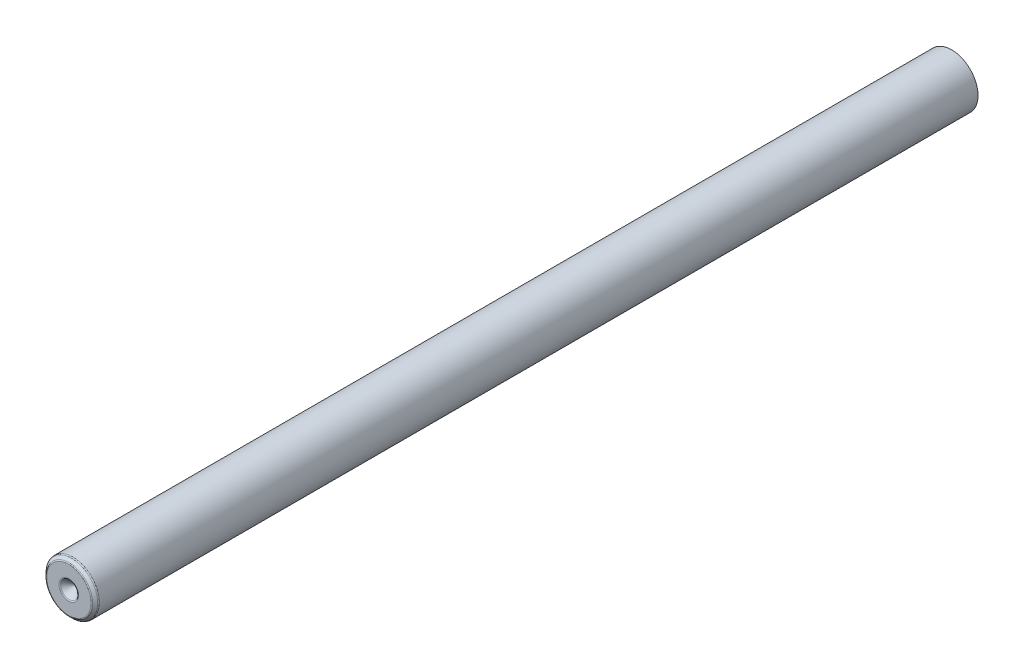
ISO-10303-21;
HEADER;
FILE_DESCRIPTION(('STEP AP214'),'2;1');
FILE_NAME('part.step','',(''),(''),'','','');
FILE_SCHEMA(('AUTOMOTIVE_DESIGN { 1 0 10303 214 1 1 1 1 }'));
ENDSEC;
DATA;
#1=APPLICATION_CONTEXT('core data for automotive mechanical design processes');
#2=APPLICATION_PROTOCOL_DEFINITION('international standard','automotive_design',2000,#1);
#3=PRODUCT_CONTEXT('',#1,'mechanical');
#4=PRODUCT('Part','Part','',(#3));
#5=PRODUCT_RELATED_PRODUCT_CATEGORY('part','',(#4));
#6=PRODUCT_DEFINITION_FORMATION('','',#4);
#7=PRODUCT_DEFINITION_CONTEXT('part definition',#1,'design');
#8=PRODUCT_DEFINITION('design','',#6,#7);
#9=PRODUCT_DEFINITION_SHAPE('','',#8);
#10=(LENGTH_UNIT() NAMED_UNIT(*) SI_UNIT(.MILLI.,.METRE.));
#11=(NAMED_UNIT(*) PLANE_ANGLE_UNIT() SI_UNIT($,.RADIAN.));
#12=(NAMED_UNIT(*) SI_UNIT($,.STERADIAN.) SOLID_ANGLE_UNIT());
#13=UNCERTAINTY_MEASURE_WITH_UNIT(LENGTH_MEASURE(1.E-05),#10,'distance_accuracy_value','');
#14=(GEOMETRIC_REPRESENTATION_CONTEXT(3) GLOBAL_UNCERTAINTY_ASSIGNED_CONTEXT((#13)) GLOBAL_UNIT_ASSIGNED_CONTEXT((#10,
#11,#12)) REPRESENTATION_CONTEXT('',''));
#15=CARTESIAN_POINT('',(0.,0.,0.));
#16=DIRECTION('',(0.,0.,1.));
#17=DIRECTION('',(1.,0.,0.));
#18=AXIS2_PLACEMENT_3D('',#15,#16,#17);
#19=CARTESIAN_POINT('',(0.,0.,503.));
#20=DIRECTION('',(0.,0.,-1.));
#21=DIRECTION('',(-1.,0.,0.));
#22=AXIS2_PLACEMENT_3D('',#19,#20,#21);
#23=CYLINDRICAL_SURFACE('',#22,15.);
#24=CARTESIAN_POINT('',(0.,0.,500.585786437627));
#25=DIRECTION('',(0.,0.,1.));
#26=DIRECTION('',(1.,0.,0.));
#27=AXIS2_PLACEMENT_3D('',#24,#25,#26);
#28=CIRCLE('',#27,15.);
#29=CARTESIAN_POINT('',(15.,0.,500.585786437627));
#30=VERTEX_POINT('',#29);
#31=EDGE_CURVE('E64',#30,#30,#28,.F.);
#32=ORIENTED_EDGE('',*,*,#31,.T.);
#33=EDGE_LOOP('',(#32));
#34=FACE_BOUND('',#33,.T.);
#35=CARTESIAN_POINT('',(0.,0.,0.));
#36=DIRECTION('',(0.,0.,1.));
#37=DIRECTION('',(1.,0.,0.));
#38=AXIS2_PLACEMENT_3D('',#35,#36,#37);
#39=CIRCLE('',#38,15.);
#40=CARTESIAN_POINT('',(15.,0.,0.));
#41=VERTEX_POINT('',#40);
#42=EDGE_CURVE('E68',#41,#41,#39,.T.);
#43=ORIENTED_EDGE('',*,*,#42,.T.);
#44=EDGE_LOOP('',(#43));
#45=FACE_BOUND('',#44,.T.);
#46=ADVANCED_FACE('F39',(#34,#45),#23,.T.);
#47=CARTESIAN_POINT('',(0.,0.,503.));
#48=DIRECTION('',(0.,0.,1.));
#49=DIRECTION('',(1.,0.,0.));
#50=AXIS2_PLACEMENT_3D('',#47,#48,#49);
#51=PLANE('',#50);
#52=CARTESIAN_POINT('',(0.,0.,503.));
#53=DIRECTION('',(0.,0.,1.));
#54=DIRECTION('',(1.,0.,0.));
#55=AXIS2_PLACEMENT_3D('',#52,#53,#54);
#56=CIRCLE('',#55,12.585786437627);
#57=CARTESIAN_POINT('',(12.585786437627,0.,503.));
#58=VERTEX_POINT('',#57);
#59=EDGE_CURVE('E46',#58,#58,#56,.T.);
#60=ORIENTED_EDGE('',*,*,#59,.T.);
#61=EDGE_LOOP('',(#60));
#62=FACE_BOUND('',#61,.T.);
#63=CARTESIAN_POINT('',(0.,0.,503.));
#64=DIRECTION('',(0.,0.,1.));
#65=DIRECTION('',(1.,0.,0.));
#66=AXIS2_PLACEMENT_3D('',#63,#64,#65);
#67=CIRCLE('',#66,5.59214986739616);
#68=CARTESIAN_POINT('',(5.59214986739616,0.,503.));
#69=VERTEX_POINT('',#68);
#70=EDGE_CURVE('E49',#69,#69,#67,.F.);
#71=ORIENTED_EDGE('',*,*,#70,.T.);
#72=EDGE_LOOP('',(#71));
#73=FACE_BOUND('',#72,.T.);
#74=ADVANCED_FACE('F77',(#62,#73),#51,.T.);
#75=CARTESIAN_POINT('',(0.,0.,0.));
#76=DIRECTION('',(0.,0.,1.));
#77=DIRECTION('',(1.,0.,0.));
#78=AXIS2_PLACEMENT_3D('',#75,#76,#77);
#79=PLANE('',#78);
#80=ORIENTED_EDGE('',*,*,#42,.F.);
#81=EDGE_LOOP('',(#80));
#82=FACE_BOUND('',#81,.T.);
#83=ADVANCED_FACE('F71',(#82),#79,.F.);
#84=CARTESIAN_POINT('',(0.,0.,503.));
#85=DIRECTION('',(0.,0.,-1.));
#86=DIRECTION('',(-1.,0.,0.));
#87=AXIS2_PLACEMENT_3D('',#84,#85,#86);
#88=CONICAL_SURFACE('',#87,13.0000000000001,0.785398163397459);
#89=CARTESIAN_POINT('',(0.,0.,501.292893218813));
#90=DIRECTION('',(0.,0.,-1.));
#91=DIRECTION('',(-1.,0.,0.));
#92=AXIS2_PLACEMENT_3D('',#89,#90,#91);
#93=CIRCLE('',#92,14.7071067811866);
#94=CARTESIAN_POINT('',(-14.7071067811866,0.,501.292893218813));
#95=VERTEX_POINT('',#94);
#96=EDGE_CURVE('E53',#95,#95,#93,.F.);
#97=ORIENTED_EDGE('',*,*,#96,.T.);
#98=EDGE_LOOP('',(#97));
#99=FACE_BOUND('',#98,.T.);
#100=CARTESIAN_POINT('',(0.,0.,502.707106781186));
#101=DIRECTION('',(0.,0.,1.));
#102=DIRECTION('',(1.,0.,0.));
#103=AXIS2_PLACEMENT_3D('',#100,#101,#102);
#104=CIRCLE('',#103,13.2928932188135);
#105=CARTESIAN_POINT('',(13.2928932188135,0.,502.707106781186));
#106=VERTEX_POINT('',#105);
#107=EDGE_CURVE('E56',#106,#106,#104,.F.);
#108=ORIENTED_EDGE('',*,*,#107,.T.);
#109=EDGE_LOOP('',(#108));
#110=FACE_BOUND('',#109,.T.);
#111=ADVANCED_FACE('F73',(#99,#110),#88,.T.);
#112=CARTESIAN_POINT('',(0.,0.,498.));
#113=DIRECTION('',(0.,0.,1.));
#114=DIRECTION('',(1.,0.,0.));
#115=AXIS2_PLACEMENT_3D('',#112,#113,#114);
#116=PLANE('',#115);
#117=CARTESIAN_POINT('',(0.,0.,498.));
#118=DIRECTION('',(0.,0.,1.));
#119=DIRECTION('',(1.,0.,0.));
#120=AXIS2_PLACEMENT_3D('',#117,#118,#119);
#121=CIRCLE('',#120,0.177936305022941);
#122=CARTESIAN_POINT('',(0.177936305022913,0.,498.));
#123=VERTEX_POINT('',#122);
#124=EDGE_CURVE('E63',#123,#123,#121,.T.);
#125=ORIENTED_EDGE('',*,*,#124,.T.);
#126=EDGE_LOOP('',(#125));
#127=FACE_BOUND('',#126,.T.);
#128=ADVANCED_FACE('F85',(#127),#116,.T.);
#129=CARTESIAN_POINT('',(0.,0.,498.));
#130=DIRECTION('',(0.,0.,1.));
#131=DIRECTION('',(1.,0.,0.));
#132=AXIS2_PLACEMENT_3D('',#129,#130,#131);
#133=CONICAL_SURFACE('',#132,0.177936305022941,0.785398163397459);
#134=CARTESIAN_POINT('',(0.,0.,502.707106781186));
#135=DIRECTION('',(0.,0.,1.));
#136=DIRECTION('',(1.,0.,0.));
#137=AXIS2_PLACEMENT_3D('',#134,#135,#136);
#138=CIRCLE('',#137,4.88504308620963);
#139=CARTESIAN_POINT('',(4.88504308620956,0.,502.707106781186));
#140=VERTEX_POINT('',#139);
#141=EDGE_CURVE('E10',#140,#140,#138,.T.);
#142=CARTESIAN_POINT('',(4.88504308620956,0.,502.707106781186));
#143=CARTESIAN_POINT('',(4.83601072390553,0.,502.658074418882));
#144=CARTESIAN_POINT('',(4.78697836160151,0.,502.609042056578));
#145=CARTESIAN_POINT('',(4.68891363699345,0.,502.51097733197));
#146=CARTESIAN_POINT('',(4.63988127468942,0.,502.461944969666));
#147=CARTESIAN_POINT('',(4.54181655008137,0.,502.363880245058));
#148=CARTESIAN_POINT('',(4.49278418777734,0.,502.314847882754));
#149=CARTESIAN_POINT('',(4.39471946316929,0.,502.216783158146));
#150=CARTESIAN_POINT('',(4.34568710086526,0.,502.167750795842));
#151=CARTESIAN_POINT('',(4.2476223762572,0.,502.069686071234));
#152=CARTESIAN_POINT('',(4.19859001395318,0.,502.02065370893));
#153=CARTESIAN_POINT('',(4.10052528934512,0.,501.922588984322));
#154=CARTESIAN_POINT('',(4.05149292704109,0.,501.873556622018));
#155=CARTESIAN_POINT('',(3.95342820243304,0.,501.77549189741));
#156=CARTESIAN_POINT('',(3.90439584012901,0.,501.726459535106));
#157=CARTESIAN_POINT('',(3.80633111552096,0.,501.628394810498));
#158=CARTESIAN_POINT('',(3.75729875321693,0.,501.579362448194));
#159=CARTESIAN_POINT('',(3.65923402860887,0.,501.481297723586));
#160=CARTESIAN_POINT('',(3.61020166630484,0.,501.432265361282));
#161=CARTESIAN_POINT('',(3.51213694169679,0.,501.334200636674));
#162=CARTESIAN_POINT('',(3.46310457939276,0.,501.28516827437));
#163=CARTESIAN_POINT('',(3.36503985478471,0.,501.187103549762));
#164=CARTESIAN_POINT('',(3.31600749248068,0.,501.138071187458));
#165=CARTESIAN_POINT('',(3.21794276787262,0.,501.04000646285));
#166=CARTESIAN_POINT('',(3.1689104055686,0.,500.990974100545));
#167=CARTESIAN_POINT('',(3.07084568096054,0.,500.892909375937));
#168=CARTESIAN_POINT('',(3.02181331865651,0.,500.843877013633));
#169=CARTESIAN_POINT('',(2.92374859404846,0.,500.745812289025));
#170=CARTESIAN_POINT('',(2.87471623174443,0.,500.696779926721));
#171=CARTESIAN_POINT('',(2.77665150713638,0.,500.598715202113));
#172=CARTESIAN_POINT('',(2.72761914483235,0.,500.549682839809));
#173=CARTESIAN_POINT('',(2.62955442022429,0.,500.451618115201));
#174=CARTESIAN_POINT('',(2.58052205792026,0.,500.402585752897));
#175=CARTESIAN_POINT('',(2.48245733331221,0.,500.304521028289));
#176=CARTESIAN_POINT('',(2.43342497100818,0.,500.255488665985));
#177=CARTESIAN_POINT('',(2.33536024640013,0.,500.157423941377));
#178=CARTESIAN_POINT('',(2.28632788409609,0.,500.108391579073));
#179=CARTESIAN_POINT('',(2.18826315948804,0.,500.010326854465));
#180=CARTESIAN_POINT('',(2.13923079718402,0.,499.961294492161));
#181=CARTESIAN_POINT('',(2.04116607257597,0.,499.863229767553));
#182=CARTESIAN_POINT('',(1.99213371027194,0.,499.814197405249));
#183=CARTESIAN_POINT('',(1.89406898566388,0.,499.716132680641));
#184=CARTESIAN_POINT('',(1.84503662335985,0.,499.667100318337));
#185=CARTESIAN_POINT('',(1.7469718987518,0.,499.569035593729));
#186=CARTESIAN_POINT('',(1.69793953644776,0.,499.520003231425));
#187=CARTESIAN_POINT('',(1.59987481183971,0.,499.421938506817));
#188=CARTESIAN_POINT('',(1.55084244953569,0.,499.372906144513));
#189=CARTESIAN_POINT('',(1.45277772492764,0.,499.274841419905));
#190=CARTESIAN_POINT('',(1.4037453626236,0.,499.2258090576));
#191=CARTESIAN_POINT('',(1.30568063801555,0.,499.127744332992));
#192=CARTESIAN_POINT('',(1.25664827571152,0.,499.078711970688));
#193=CARTESIAN_POINT('',(1.15858355110347,0.,498.98064724608));
#194=CARTESIAN_POINT('',(1.10955118879944,0.,498.931614883776));
#195=CARTESIAN_POINT('',(1.01148646419138,0.,498.833550159168));
#196=CARTESIAN_POINT('',(0.962454101887355,0.,498.784517796864));
#197=CARTESIAN_POINT('',(0.8643893772793,0.,498.686453072256));
#198=CARTESIAN_POINT('',(0.815357014975272,0.,498.637420709952));
#199=CARTESIAN_POINT('',(0.717292290367217,0.,498.539355985344));
#200=CARTESIAN_POINT('',(0.668259928063189,0.,498.49032362304));
#201=CARTESIAN_POINT('',(0.570195203455134,0.,498.392258898432));
#202=CARTESIAN_POINT('',(0.521162841151106,0.,498.343226536128));
#203=CARTESIAN_POINT('',(0.423098116543051,0.,498.24516181152));
#204=CARTESIAN_POINT('',(0.374065754239024,0.,498.196129449216));
#205=CARTESIAN_POINT('',(0.276001029630968,0.,498.098064724608));
#206=CARTESIAN_POINT('',(0.226968667326941,0.,498.049032362304));
#207=CARTESIAN_POINT('',(0.177936305022913,0.,498.));
#208=B_SPLINE_CURVE_WITH_KNOTS('',3,(#142,#143,#144,#145,#146,#147,#148,#149,#150,#151,#152,
#153,#154,#155,#156,#157,#158,#159,#160,#161,#162,#163,#164,#165,#166,#167,#168,#169,#170,#171,
#172,#173,#174,#175,#176,#177,#178,#179,#180,#181,#182,#183,#184,#185,#186,#187,#188,#189,#190,
#191,#192,#193,#194,#195,#196,#197,#198,#199,#200,#201,#202,#203,#204,#205,#206,#207),
.UNSPECIFIED.,.F.,.F.,(4,2,2,2,2,2,2,2,2,2,2,2,2,2,2,2,2,2,2,2,2,2,2,2,2,2,2,2,2,2,2,2,4),(0.,
0.208026695296635,0.41605339059327,0.624080085889905,0.83210678118654,1.04013347648317,
1.24816017177981,1.45618686707644,1.66421356237308,1.87224025766971,2.08026695296635,
2.28829364826298,2.49632034355962,2.70434703885625,2.91237373415289,3.12040042944952,
3.32842712474616,3.53645382004279,3.74448051533943,3.9525072106361,4.16053390593274,
4.36856060122937,4.57658729652601,4.78461399182268,4.99264068711932,5.20066738241595,
5.40869407771259,5.61672077300922,5.82474746830585,6.03277416360249,6.24080085889912,
6.44882755419576,6.65685424949239),.UNSPECIFIED.);
#209=EDGE_CURVE('BSEAM100',#140,#123,#208,.T.);
#210=ORIENTED_EDGE('',*,*,#141,.T.);
#211=ORIENTED_EDGE('',*,*,#124,.F.);
#212=ORIENTED_EDGE('',*,*,#209,.T.);
#213=ORIENTED_EDGE('',*,*,#209,.F.);
#214=EDGE_LOOP('',(#210,#212,#211,#213));
#215=FACE_BOUND('',#214,.T.);
#216=ADVANCED_FACE('F100',(#215),#133,.F.);
#217=CARTESIAN_POINT('',(0.,0.,500.585786437627));
#218=DIRECTION('',(0.,0.,1.));
#219=DIRECTION('',(1.,0.,0.));
#220=AXIS2_PLACEMENT_3D('',#217,#218,#219);
#221=TOROIDAL_SURFACE('',#220,14.,1.);
#222=ORIENTED_EDGE('',*,*,#96,.F.);
#223=EDGE_LOOP('',(#222));
#224=FACE_BOUND('',#223,.T.);
#225=ORIENTED_EDGE('',*,*,#31,.F.);
#226=EDGE_LOOP('',(#225));
#227=FACE_BOUND('',#226,.T.);
#228=ADVANCED_FACE('F105',(#224,#227),#221,.T.);
#229=CARTESIAN_POINT('',(0.,0.,502.));
#230=DIRECTION('',(0.,0.,1.));
#231=DIRECTION('',(1.,0.,0.));
#232=AXIS2_PLACEMENT_3D('',#229,#230,#231);
#233=TOROIDAL_SURFACE('',#232,12.585786437627,1.);
#234=ORIENTED_EDGE('',*,*,#107,.F.);
#235=EDGE_LOOP('',(#234));
#236=FACE_BOUND('',#235,.T.);
#237=ORIENTED_EDGE('',*,*,#59,.F.);
#238=EDGE_LOOP('',(#237));
#239=FACE_BOUND('',#238,.T.);
#240=ADVANCED_FACE('F102',(#236,#239),#233,.T.);
#241=CARTESIAN_POINT('',(0.,0.,502.));
#242=DIRECTION('',(0.,0.,1.));
#243=DIRECTION('',(1.,0.,0.));
#244=AXIS2_PLACEMENT_3D('',#241,#242,#243);
#245=TOROIDAL_SURFACE('',#244,5.59214986739616,1.);
#246=ORIENTED_EDGE('',*,*,#70,.F.);
#247=EDGE_LOOP('',(#246));
#248=FACE_BOUND('',#247,.T.);
#249=ORIENTED_EDGE('',*,*,#141,.F.);
#250=EDGE_LOOP('',(#249));
#251=FACE_BOUND('',#250,.T.);
#252=ADVANCED_FACE('F41',(#248,#251),#245,.T.);
#253=CLOSED_SHELL('',(#46,#74,#83,#111,#128,#216,#228,#240,#252));
#254=MANIFOLD_SOLID_BREP('B2',#253);
#255=ADVANCED_BREP_SHAPE_REPRESENTATION('',(#18,#254),#14);
#256=SHAPE_DEFINITION_REPRESENTATION(#9,#255);
ENDSEC;
END-ISO-10303-21;
